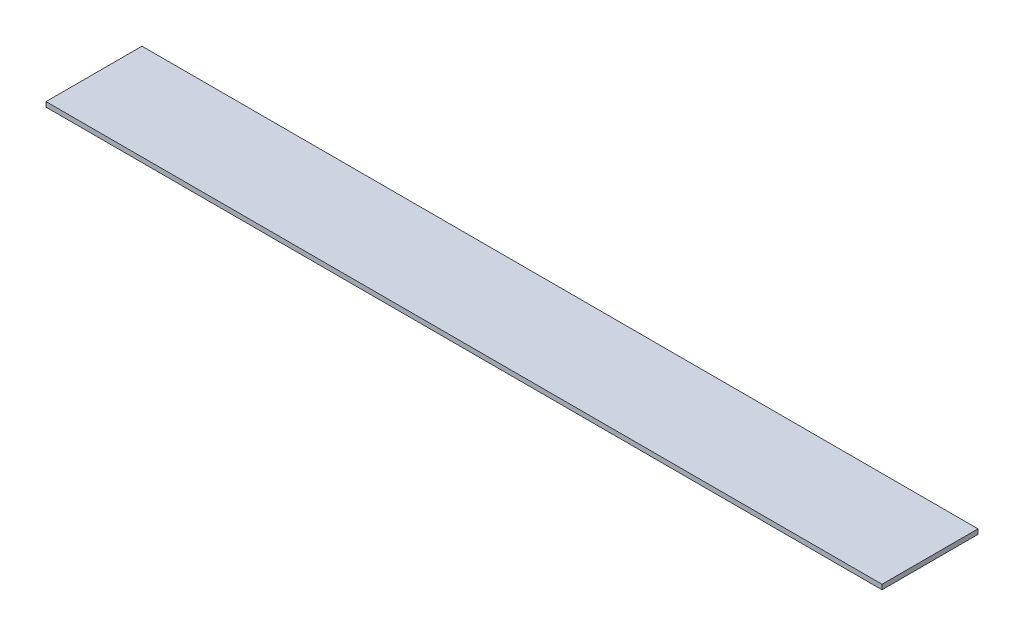
ISO-10303-21;
HEADER;
FILE_DESCRIPTION(('STEP AP214'),'2;1');
FILE_NAME('part.step','',(''),(''),'','','');
FILE_SCHEMA(('AUTOMOTIVE_DESIGN { 1 0 10303 214 1 1 1 1 }'));
ENDSEC;
DATA;
#1=APPLICATION_CONTEXT('core data for automotive mechanical design processes');
#2=APPLICATION_PROTOCOL_DEFINITION('international standard','automotive_design',2000,#1);
#3=PRODUCT_CONTEXT('',#1,'mechanical');
#4=PRODUCT('Part','Part','',(#3));
#5=PRODUCT_RELATED_PRODUCT_CATEGORY('part','',(#4));
#6=PRODUCT_DEFINITION_FORMATION('','',#4);
#7=PRODUCT_DEFINITION_CONTEXT('part definition',#1,'design');
#8=PRODUCT_DEFINITION('design','',#6,#7);
#9=PRODUCT_DEFINITION_SHAPE('','',#8);
#10=(LENGTH_UNIT() NAMED_UNIT(*) SI_UNIT(.MILLI.,.METRE.));
#11=(NAMED_UNIT(*) PLANE_ANGLE_UNIT() SI_UNIT($,.RADIAN.));
#12=(NAMED_UNIT(*) SI_UNIT($,.STERADIAN.) SOLID_ANGLE_UNIT());
#13=UNCERTAINTY_MEASURE_WITH_UNIT(LENGTH_MEASURE(1.E-05),#10,'distance_accuracy_value','');
#14=(GEOMETRIC_REPRESENTATION_CONTEXT(3) GLOBAL_UNCERTAINTY_ASSIGNED_CONTEXT((#13)) GLOBAL_UNIT_ASSIGNED_CONTEXT((#10,
#11,#12)) REPRESENTATION_CONTEXT('',''));
#15=CARTESIAN_POINT('',(0.,0.,0.));
#16=DIRECTION('',(0.,0.,1.));
#17=DIRECTION('',(1.,0.,0.));
#18=AXIS2_PLACEMENT_3D('',#15,#16,#17);
#19=CARTESIAN_POINT('',(435.49512,0.,25.));
#20=DIRECTION('',(0.,0.,1.));
#21=DIRECTION('',(1.,0.,0.));
#22=AXIS2_PLACEMENT_3D('',#19,#20,#21);
#23=PLANE('',#22);
#24=DIRECTION('',(0.,1.,0.));
#25=VECTOR('',#24,1.);
#26=CARTESIAN_POINT('',(0.,0.,25.));
#27=LINE('',#26,#25);
#28=CARTESIAN_POINT('',(0.,-1.25857,25.));
#29=VERTEX_POINT('',#28);
#30=CARTESIAN_POINT('',(0.,1.25857,25.));
#31=VERTEX_POINT('',#30);
#32=EDGE_CURVE('E97',#29,#31,#27,.T.);
#33=ORIENTED_EDGE('',*,*,#32,.F.);
#34=DIRECTION('',(-1.,0.,0.));
#35=VECTOR('',#34,1.);
#36=CARTESIAN_POINT('',(435.49512,-1.25857,25.));
#37=LINE('',#36,#35);
#38=CARTESIAN_POINT('',(435.49512,-1.25857,25.));
#39=VERTEX_POINT('',#38);
#40=EDGE_CURVE('E11',#39,#29,#37,.T.);
#41=ORIENTED_EDGE('',*,*,#40,.F.);
#42=DIRECTION('',(0.,1.,0.));
#43=VECTOR('',#42,1.);
#44=CARTESIAN_POINT('',(435.49512,0.,25.));
#45=LINE('',#44,#43);
#46=CARTESIAN_POINT('',(435.49512,1.25857,25.));
#47=VERTEX_POINT('',#46);
#48=EDGE_CURVE('E91',#39,#47,#45,.T.);
#49=ORIENTED_EDGE('',*,*,#48,.T.);
#50=DIRECTION('',(-1.,0.,0.));
#51=VECTOR('',#50,1.);
#52=CARTESIAN_POINT('',(435.49512,1.25857,25.));
#53=LINE('',#52,#51);
#54=EDGE_CURVE('E72',#47,#31,#53,.T.);
#55=ORIENTED_EDGE('',*,*,#54,.T.);
#56=EDGE_LOOP('',(#33,#41,#49,#55));
#57=FACE_BOUND('',#56,.T.);
#58=ADVANCED_FACE('F34',(#57),#23,.T.);
#59=CARTESIAN_POINT('',(435.49512,-1.25857,0.));
#60=DIRECTION('',(0.,-1.,0.));
#61=DIRECTION('',(0.,0.,-1.));
#62=AXIS2_PLACEMENT_3D('',#59,#60,#61);
#63=PLANE('',#62);
#64=DIRECTION('',(0.,0.,1.));
#65=VECTOR('',#64,1.);
#66=CARTESIAN_POINT('',(0.,-1.25857,0.));
#67=LINE('',#66,#65);
#68=CARTESIAN_POINT('',(0.,-1.25857,-25.));
#69=VERTEX_POINT('',#68);
#70=EDGE_CURVE('E85',#69,#29,#67,.T.);
#71=ORIENTED_EDGE('',*,*,#70,.F.);
#72=DIRECTION('',(-1.,0.,0.));
#73=VECTOR('',#72,1.);
#74=CARTESIAN_POINT('',(435.49512,-1.25857,-25.));
#75=LINE('',#74,#73);
#76=CARTESIAN_POINT('',(435.49512,-1.25857,-25.));
#77=VERTEX_POINT('',#76);
#78=EDGE_CURVE('E42',#77,#69,#75,.T.);
#79=ORIENTED_EDGE('',*,*,#78,.F.);
#80=DIRECTION('',(0.,0.,1.));
#81=VECTOR('',#80,1.);
#82=CARTESIAN_POINT('',(435.49512,-1.25857,0.));
#83=LINE('',#82,#81);
#84=EDGE_CURVE('E83',#77,#39,#83,.T.);
#85=ORIENTED_EDGE('',*,*,#84,.T.);
#86=ORIENTED_EDGE('',*,*,#40,.T.);
#87=EDGE_LOOP('',(#71,#79,#85,#86));
#88=FACE_BOUND('',#87,.T.);
#89=ADVANCED_FACE('F81',(#88),#63,.T.);
#90=CARTESIAN_POINT('',(435.49512,0.,-25.));
#91=DIRECTION('',(0.,0.,1.));
#92=DIRECTION('',(1.,0.,0.));
#93=AXIS2_PLACEMENT_3D('',#90,#91,#92);
#94=PLANE('',#93);
#95=DIRECTION('',(0.,1.,0.));
#96=VECTOR('',#95,1.);
#97=CARTESIAN_POINT('',(0.,0.,-25.));
#98=LINE('',#97,#96);
#99=CARTESIAN_POINT('',(0.,1.25857,-25.));
#100=VERTEX_POINT('',#99);
#101=EDGE_CURVE('E65',#69,#100,#98,.T.);
#102=ORIENTED_EDGE('',*,*,#101,.T.);
#103=DIRECTION('',(-1.,0.,0.));
#104=VECTOR('',#103,1.);
#105=CARTESIAN_POINT('',(435.49512,1.25857,-25.));
#106=LINE('',#105,#104);
#107=CARTESIAN_POINT('',(435.49512,1.25857,-25.));
#108=VERTEX_POINT('',#107);
#109=EDGE_CURVE('E86',#108,#100,#106,.T.);
#110=ORIENTED_EDGE('',*,*,#109,.F.);
#111=DIRECTION('',(0.,1.,0.));
#112=VECTOR('',#111,1.);
#113=CARTESIAN_POINT('',(435.49512,0.,-25.));
#114=LINE('',#113,#112);
#115=EDGE_CURVE('E87',#77,#108,#114,.T.);
#116=ORIENTED_EDGE('',*,*,#115,.F.);
#117=ORIENTED_EDGE('',*,*,#78,.T.);
#118=EDGE_LOOP('',(#102,#110,#116,#117));
#119=FACE_BOUND('',#118,.T.);
#120=ADVANCED_FACE('F88',(#119),#94,.F.);
#121=CARTESIAN_POINT('',(435.49512,1.25857,0.));
#122=DIRECTION('',(0.,-1.,0.));
#123=DIRECTION('',(0.,0.,-1.));
#124=AXIS2_PLACEMENT_3D('',#121,#122,#123);
#125=PLANE('',#124);
#126=DIRECTION('',(0.,0.,1.));
#127=VECTOR('',#126,1.);
#128=CARTESIAN_POINT('',(0.,1.25857,0.));
#129=LINE('',#128,#127);
#130=EDGE_CURVE('E93',#100,#31,#129,.T.);
#131=ORIENTED_EDGE('',*,*,#130,.T.);
#132=ORIENTED_EDGE('',*,*,#54,.F.);
#133=DIRECTION('',(0.,0.,1.));
#134=VECTOR('',#133,1.);
#135=CARTESIAN_POINT('',(435.49512,1.25857,0.));
#136=LINE('',#135,#134);
#137=EDGE_CURVE('E50',#108,#47,#136,.T.);
#138=ORIENTED_EDGE('',*,*,#137,.F.);
#139=ORIENTED_EDGE('',*,*,#109,.T.);
#140=EDGE_LOOP('',(#131,#132,#138,#139));
#141=FACE_BOUND('',#140,.T.);
#142=ADVANCED_FACE('F106',(#141),#125,.F.);
#143=CARTESIAN_POINT('',(435.49512,0.,0.));
#144=DIRECTION('',(1.,0.,0.));
#145=DIRECTION('',(0.,0.,-1.));
#146=AXIS2_PLACEMENT_3D('',#143,#144,#145);
#147=PLANE('',#146);
#148=ORIENTED_EDGE('',*,*,#48,.F.);
#149=ORIENTED_EDGE('',*,*,#84,.F.);
#150=ORIENTED_EDGE('',*,*,#115,.T.);
#151=ORIENTED_EDGE('',*,*,#137,.T.);
#152=EDGE_LOOP('',(#148,#149,#150,#151));
#153=FACE_BOUND('',#152,.T.);
#154=ADVANCED_FACE('F90',(#153),#147,.T.);
#155=CARTESIAN_POINT('',(0.,0.,0.));
#156=DIRECTION('',(1.,0.,0.));
#157=DIRECTION('',(0.,0.,-1.));
#158=AXIS2_PLACEMENT_3D('',#155,#156,#157);
#159=PLANE('',#158);
#160=ORIENTED_EDGE('',*,*,#32,.T.);
#161=ORIENTED_EDGE('',*,*,#130,.F.);
#162=ORIENTED_EDGE('',*,*,#101,.F.);
#163=ORIENTED_EDGE('',*,*,#70,.T.);
#164=EDGE_LOOP('',(#160,#161,#162,#163));
#165=FACE_BOUND('',#164,.T.);
#166=ADVANCED_FACE('F108',(#165),#159,.F.);
#167=CLOSED_SHELL('',(#58,#89,#120,#142,#154,#166));
#168=MANIFOLD_SOLID_BREP('B2',#167);
#169=ADVANCED_BREP_SHAPE_REPRESENTATION('',(#18,#168),#14);
#170=SHAPE_DEFINITION_REPRESENTATION(#9,#169);
ENDSEC;
END-ISO-10303-21;
